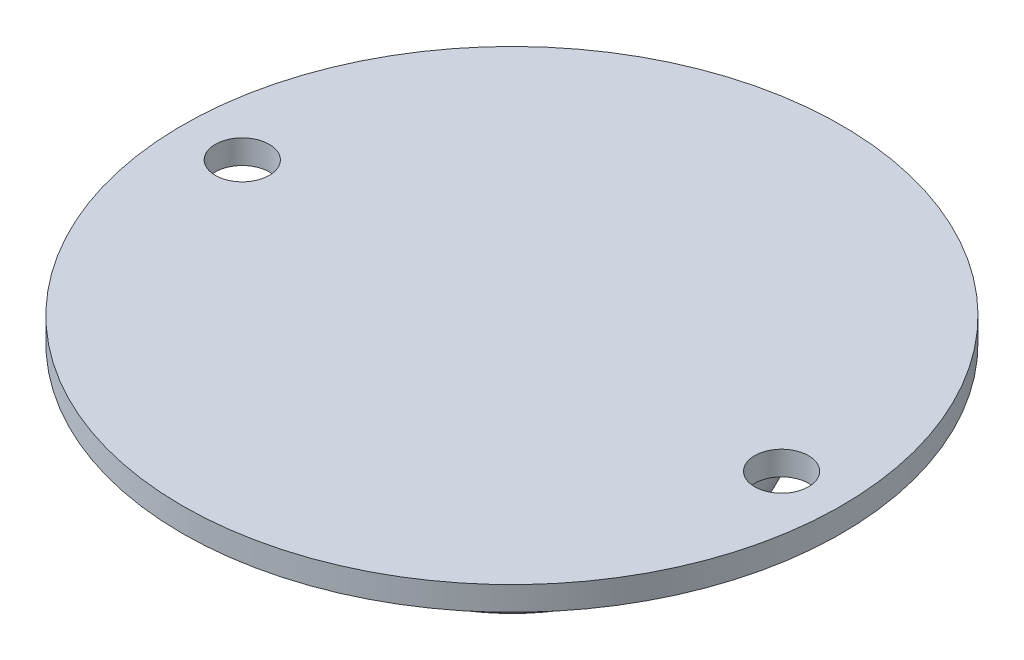
ISO-10303-21;
HEADER;
FILE_DESCRIPTION(('STEP AP214'),'2;1');
FILE_NAME('part.step','',(''),(''),'','','');
FILE_SCHEMA(('AUTOMOTIVE_DESIGN { 1 0 10303 214 1 1 1 1 }'));
ENDSEC;
DATA;
#1=APPLICATION_CONTEXT('core data for automotive mechanical design processes');
#2=APPLICATION_PROTOCOL_DEFINITION('international standard','automotive_design',2000,#1);
#3=PRODUCT_CONTEXT('',#1,'mechanical');
#4=PRODUCT('Part','Part','',(#3));
#5=PRODUCT_RELATED_PRODUCT_CATEGORY('part','',(#4));
#6=PRODUCT_DEFINITION_FORMATION('','',#4);
#7=PRODUCT_DEFINITION_CONTEXT('part definition',#1,'design');
#8=PRODUCT_DEFINITION('design','',#6,#7);
#9=PRODUCT_DEFINITION_SHAPE('','',#8);
#10=(LENGTH_UNIT() NAMED_UNIT(*) SI_UNIT(.MILLI.,.METRE.));
#11=(NAMED_UNIT(*) PLANE_ANGLE_UNIT() SI_UNIT($,.RADIAN.));
#12=(NAMED_UNIT(*) SI_UNIT($,.STERADIAN.) SOLID_ANGLE_UNIT());
#13=UNCERTAINTY_MEASURE_WITH_UNIT(LENGTH_MEASURE(1.E-05),#10,'distance_accuracy_value','');
#14=(GEOMETRIC_REPRESENTATION_CONTEXT(3) GLOBAL_UNCERTAINTY_ASSIGNED_CONTEXT((#13)) GLOBAL_UNIT_ASSIGNED_CONTEXT((#10,
#11,#12)) REPRESENTATION_CONTEXT('',''));
#15=CARTESIAN_POINT('',(0.,0.,0.));
#16=DIRECTION('',(0.,0.,1.));
#17=DIRECTION('',(1.,0.,0.));
#18=AXIS2_PLACEMENT_3D('',#15,#16,#17);
#19=CARTESIAN_POINT('',(0.,12.,0.));
#20=DIRECTION('',(0.,-1.,0.));
#21=DIRECTION('',(0.,0.,-1.));
#22=AXIS2_PLACEMENT_3D('',#19,#20,#21);
#23=CYLINDRICAL_SURFACE('',#22,17.5);
#24=DIRECTION('',(0.,-1.,0.));
#25=VECTOR('',#24,1.);
#26=CARTESIAN_POINT('',(-2.25,12.,-17.3547543918086));
#27=LINE('',#26,#25);
#28=CARTESIAN_POINT('',(-2.25,12.,-17.3547543918086));
#29=VERTEX_POINT('',#28);
#30=CARTESIAN_POINT('',(-2.25,10.,-17.3547543918086));
#31=VERTEX_POINT('',#30);
#32=EDGE_CURVE('E161',#29,#31,#27,.T.);
#33=ORIENTED_EDGE('',*,*,#32,.T.);
#34=CARTESIAN_POINT('',(0.,10.,0.));
#35=DIRECTION('',(0.,1.,0.));
#36=DIRECTION('',(0.,0.,1.));
#37=AXIS2_PLACEMENT_3D('',#34,#35,#36);
#38=CIRCLE('',#37,17.5);
#39=CARTESIAN_POINT('',(-2.25,10.,17.3547543918086));
#40=VERTEX_POINT('',#39);
#41=EDGE_CURVE('E102',#31,#40,#38,.T.);
#42=ORIENTED_EDGE('',*,*,#41,.T.);
#43=DIRECTION('',(0.,-1.,0.));
#44=VECTOR('',#43,1.);
#45=CARTESIAN_POINT('',(-2.25,12.,17.3547543918086));
#46=LINE('',#45,#44);
#47=CARTESIAN_POINT('',(-2.25,12.,17.3547543918086));
#48=VERTEX_POINT('',#47);
#49=EDGE_CURVE('E166',#40,#48,#46,.F.);
#50=ORIENTED_EDGE('',*,*,#49,.T.);
#51=CARTESIAN_POINT('',(0.,12.,0.));
#52=DIRECTION('',(0.,1.,0.));
#53=DIRECTION('',(0.,0.,1.));
#54=AXIS2_PLACEMENT_3D('',#51,#52,#53);
#55=CIRCLE('',#54,17.5);
#56=EDGE_CURVE('E103',#29,#48,#55,.T.);
#57=ORIENTED_EDGE('',*,*,#56,.F.);
#58=EDGE_LOOP('',(#33,#42,#50,#57));
#59=FACE_BOUND('',#58,.T.);
#60=ADVANCED_FACE('F33',(#59),#23,.T.);
#61=CARTESIAN_POINT('',(0.,0.,0.));
#62=DIRECTION('',(0.,1.,0.));
#63=DIRECTION('',(0.,0.,1.));
#64=AXIS2_PLACEMENT_3D('',#61,#62,#63);
#65=PLANE('',#64);
#66=DIRECTION('',(0.,0.,-1.));
#67=VECTOR('',#66,1.);
#68=CARTESIAN_POINT('',(-2.25,0.,-21.9035443512894));
#69=LINE('',#68,#67);
#70=CARTESIAN_POINT('',(-2.25,0.,7.1545440106271));
#71=VERTEX_POINT('',#70);
#72=CARTESIAN_POINT('',(-2.25,0.,-7.1545440106271));
#73=VERTEX_POINT('',#72);
#74=EDGE_CURVE('E286',#71,#73,#69,.T.);
#75=ORIENTED_EDGE('',*,*,#74,.F.);
#76=CARTESIAN_POINT('',(0.,0.,0.));
#77=DIRECTION('',(0.,1.,0.));
#78=DIRECTION('',(0.,0.,1.));
#79=AXIS2_PLACEMENT_3D('',#76,#77,#78);
#80=CIRCLE('',#79,7.50000000000001);
#81=EDGE_CURVE('E171',#71,#73,#80,.F.);
#82=ORIENTED_EDGE('',*,*,#81,.T.);
#83=EDGE_LOOP('',(#75,#82));
#84=FACE_BOUND('',#83,.T.);
#85=ADVANCED_FACE('F149',(#84),#65,.F.);
#86=DIRECTION('',(0.,-1.,0.));
#87=VECTOR('',#86,1.);
#88=CARTESIAN_POINT('',(2.25,12.,17.3547543918086));
#89=LINE('',#88,#87);
#90=CARTESIAN_POINT('',(2.25,12.,17.3547543918086));
#91=VERTEX_POINT('',#90);
#92=CARTESIAN_POINT('',(2.25,10.,17.3547543918086));
#93=VERTEX_POINT('',#92);
#94=EDGE_CURVE('E92',#91,#93,#89,.T.);
#95=ORIENTED_EDGE('',*,*,#94,.T.);
#96=CARTESIAN_POINT('',(0.,10.,0.));
#97=DIRECTION('',(0.,1.,0.));
#98=DIRECTION('',(0.,0.,1.));
#99=AXIS2_PLACEMENT_3D('',#96,#97,#98);
#100=CIRCLE('',#99,17.5);
#101=CARTESIAN_POINT('',(2.25,10.,-17.3547543918086));
#102=VERTEX_POINT('',#101);
#103=EDGE_CURVE('E91',#93,#102,#100,.T.);
#104=ORIENTED_EDGE('',*,*,#103,.T.);
#105=DIRECTION('',(0.,-1.,0.));
#106=VECTOR('',#105,1.);
#107=CARTESIAN_POINT('',(2.25,12.,-17.3547543918086));
#108=LINE('',#107,#106);
#109=CARTESIAN_POINT('',(2.25,12.,-17.3547543918086));
#110=VERTEX_POINT('',#109);
#111=EDGE_CURVE('E84',#102,#110,#108,.F.);
#112=ORIENTED_EDGE('',*,*,#111,.T.);
#113=EDGE_CURVE('E89',#91,#110,#55,.T.);
#114=ORIENTED_EDGE('',*,*,#113,.F.);
#115=EDGE_LOOP('',(#95,#104,#112,#114));
#116=FACE_BOUND('',#115,.T.);
#117=ADVANCED_FACE('F87',(#116),#23,.T.);
#118=DIRECTION('',(0.,0.,1.));
#119=VECTOR('',#118,1.);
#120=CARTESIAN_POINT('',(2.25,0.,-21.9035443512894));
#121=LINE('',#120,#119);
#122=CARTESIAN_POINT('',(2.25,0.,-7.1545440106271));
#123=VERTEX_POINT('',#122);
#124=CARTESIAN_POINT('',(2.25,0.,7.15454401062709));
#125=VERTEX_POINT('',#124);
#126=EDGE_CURVE('E184',#123,#125,#121,.T.);
#127=ORIENTED_EDGE('',*,*,#126,.F.);
#128=CARTESIAN_POINT('',(0.,0.,0.));
#129=DIRECTION('',(0.,1.,0.));
#130=DIRECTION('',(0.,0.,1.));
#131=AXIS2_PLACEMENT_3D('',#128,#129,#130);
#132=CIRCLE('',#131,7.50000000000001);
#133=EDGE_CURVE('E11',#123,#125,#132,.F.);
#134=ORIENTED_EDGE('',*,*,#133,.T.);
#135=EDGE_LOOP('',(#127,#134));
#136=FACE_BOUND('',#135,.T.);
#137=ADVANCED_FACE('F146',(#136),#65,.F.);
#138=CARTESIAN_POINT('',(0.,14.,0.));
#139=DIRECTION('',(0.,-1.,0.));
#140=DIRECTION('',(0.,0.,-1.));
#141=AXIS2_PLACEMENT_3D('',#138,#139,#140);
#142=CYLINDRICAL_SURFACE('',#141,27.5);
#143=CARTESIAN_POINT('',(0.,14.,0.));
#144=DIRECTION('',(0.,1.,0.));
#145=DIRECTION('',(0.,0.,1.));
#146=AXIS2_PLACEMENT_3D('',#143,#144,#145);
#147=CIRCLE('',#146,27.5);
#148=CARTESIAN_POINT('',(0.,14.,27.5));
#149=VERTEX_POINT('',#148);
#150=EDGE_CURVE('E109',#149,#149,#147,.T.);
#151=ORIENTED_EDGE('',*,*,#150,.F.);
#152=EDGE_LOOP('',(#151));
#153=FACE_BOUND('',#152,.T.);
#154=CARTESIAN_POINT('',(0.,12.,0.));
#155=DIRECTION('',(0.,1.,0.));
#156=DIRECTION('',(0.,0.,1.));
#157=AXIS2_PLACEMENT_3D('',#154,#155,#156);
#158=CIRCLE('',#157,27.5);
#159=CARTESIAN_POINT('',(0.,12.,27.5));
#160=VERTEX_POINT('',#159);
#161=EDGE_CURVE('E111',#160,#160,#158,.T.);
#162=ORIENTED_EDGE('',*,*,#161,.T.);
#163=EDGE_LOOP('',(#162));
#164=FACE_BOUND('',#163,.T.);
#165=ADVANCED_FACE('F139',(#153,#164),#142,.T.);
#166=CARTESIAN_POINT('',(0.,14.,0.));
#167=DIRECTION('',(0.,1.,0.));
#168=DIRECTION('',(0.,0.,1.));
#169=AXIS2_PLACEMENT_3D('',#166,#167,#168);
#170=PLANE('',#169);
#171=CARTESIAN_POINT('',(-22.5,14.,0.));
#172=DIRECTION('',(0.,1.,0.));
#173=DIRECTION('',(0.,0.,1.));
#174=AXIS2_PLACEMENT_3D('',#171,#172,#173);
#175=CIRCLE('',#174,2.25);
#176=CARTESIAN_POINT('',(-22.5,14.,2.25));
#177=VERTEX_POINT('',#176);
#178=EDGE_CURVE('E273',#177,#177,#175,.T.);
#179=ORIENTED_EDGE('',*,*,#178,.F.);
#180=EDGE_LOOP('',(#179));
#181=FACE_BOUND('',#180,.T.);
#182=CARTESIAN_POINT('',(22.5,14.,0.));
#183=DIRECTION('',(0.,1.,0.));
#184=DIRECTION('',(0.,0.,1.));
#185=AXIS2_PLACEMENT_3D('',#182,#183,#184);
#186=CIRCLE('',#185,2.25);
#187=CARTESIAN_POINT('',(22.5,14.,2.25));
#188=VERTEX_POINT('',#187);
#189=EDGE_CURVE('E283',#188,#188,#186,.T.);
#190=ORIENTED_EDGE('',*,*,#189,.F.);
#191=EDGE_LOOP('',(#190));
#192=FACE_BOUND('',#191,.T.);
#193=ORIENTED_EDGE('',*,*,#150,.T.);
#194=EDGE_LOOP('',(#193));
#195=FACE_BOUND('',#194,.T.);
#196=ADVANCED_FACE('F135',(#181,#192,#195),#170,.T.);
#197=CARTESIAN_POINT('',(0.,12.,0.));
#198=DIRECTION('',(0.,1.,0.));
#199=DIRECTION('',(0.,0.,1.));
#200=AXIS2_PLACEMENT_3D('',#197,#198,#199);
#201=PLANE('',#200);
#202=CARTESIAN_POINT('',(-22.5,12.,0.));
#203=DIRECTION('',(0.,-1.,0.));
#204=DIRECTION('',(0.,0.,-1.));
#205=AXIS2_PLACEMENT_3D('',#202,#203,#204);
#206=CIRCLE('',#205,2.25);
#207=CARTESIAN_POINT('',(-22.5,12.,-2.25));
#208=VERTEX_POINT('',#207);
#209=EDGE_CURVE('E276',#208,#208,#206,.T.);
#210=ORIENTED_EDGE('',*,*,#209,.F.);
#211=EDGE_LOOP('',(#210));
#212=FACE_BOUND('',#211,.T.);
#213=CARTESIAN_POINT('',(22.5,12.,0.));
#214=DIRECTION('',(0.,-1.,0.));
#215=DIRECTION('',(0.,0.,-1.));
#216=AXIS2_PLACEMENT_3D('',#213,#214,#215);
#217=CIRCLE('',#216,2.25);
#218=CARTESIAN_POINT('',(22.5,12.,-2.25));
#219=VERTEX_POINT('',#218);
#220=EDGE_CURVE('E278',#219,#219,#217,.T.);
#221=ORIENTED_EDGE('',*,*,#220,.F.);
#222=EDGE_LOOP('',(#221));
#223=FACE_BOUND('',#222,.T.);
#224=DIRECTION('',(0.,0.,-1.));
#225=VECTOR('',#224,1.);
#226=CARTESIAN_POINT('',(-2.25,12.,-21.9035443512894));
#227=LINE('',#226,#225);
#228=EDGE_CURVE('E98',#48,#29,#227,.T.);
#229=ORIENTED_EDGE('',*,*,#228,.T.);
#230=ORIENTED_EDGE('',*,*,#56,.T.);
#231=EDGE_LOOP('',(#229,#230));
#232=FACE_BOUND('',#231,.T.);
#233=ORIENTED_EDGE('',*,*,#113,.T.);
#234=DIRECTION('',(0.,0.,1.));
#235=VECTOR('',#234,1.);
#236=CARTESIAN_POINT('',(2.25,12.,-21.9035443512894));
#237=LINE('',#236,#235);
#238=EDGE_CURVE('E93',#110,#91,#237,.T.);
#239=ORIENTED_EDGE('',*,*,#238,.T.);
#240=EDGE_LOOP('',(#233,#239));
#241=FACE_BOUND('',#240,.T.);
#242=ORIENTED_EDGE('',*,*,#161,.F.);
#243=EDGE_LOOP('',(#242));
#244=FACE_BOUND('',#243,.T.);
#245=ADVANCED_FACE('F100',(#212,#223,#232,#241,#244),#201,.F.);
#246=CARTESIAN_POINT('',(-2.25,56.0376091607572,-21.9035443512894));
#247=DIRECTION('',(-1.,0.,0.));
#248=DIRECTION('',(0.,0.,1.));
#249=AXIS2_PLACEMENT_3D('',#246,#247,#248);
#250=PLANE('',#249);
#251=ORIENTED_EDGE('',*,*,#49,.F.);
#252=CARTESIAN_POINT('',(-2.25,10.,17.3547543918086));
#253=CARTESIAN_POINT('',(-2.25,9.72075758345696,17.3547851548186));
#254=CARTESIAN_POINT('',(-2.25,9.44151985552662,17.3429613553299));
#255=CARTESIAN_POINT('',(-2.25,8.88504861329375,17.2958269927778));
#256=CARTESIAN_POINT('',(-2.25,8.60781498846542,17.2605177350765));
#257=CARTESIAN_POINT('',(-2.25,8.05756983275056,17.1666781784053));
#258=CARTESIAN_POINT('',(-2.25,7.78455463475679,17.1081693820687));
#259=CARTESIAN_POINT('',(-2.25,7.24442574681187,16.9683658481769));
#260=CARTESIAN_POINT('',(-2.25,6.97731199240333,16.8870713596269));
#261=CARTESIAN_POINT('',(-2.25,6.45075991447519,16.7022427484806));
#262=CARTESIAN_POINT('',(-2.25,6.1913250514883,16.5986987675587));
#263=CARTESIAN_POINT('',(-2.25,5.68208952318507,16.3701447485989));
#264=CARTESIAN_POINT('',(-2.25,5.43228888501358,16.2451346500847));
#265=CARTESIAN_POINT('',(-2.25,4.94410843450086,15.9745692094334));
#266=CARTESIAN_POINT('',(-2.25,4.70572743673211,15.8290160060115));
#267=CARTESIAN_POINT('',(-2.25,4.24203009947778,15.5184093333134));
#268=CARTESIAN_POINT('',(-2.25,4.01671371435312,15.3533559321642));
#269=CARTESIAN_POINT('',(-2.25,3.58027350716704,15.0045907148946));
#270=CARTESIAN_POINT('',(-2.25,3.36917913617393,14.8208420458456));
#271=CARTESIAN_POINT('',(-2.25,2.96314009130131,14.4362929546114));
#272=CARTESIAN_POINT('',(-2.25,2.76819549077723,14.2354924549819));
#273=CARTESIAN_POINT('',(-2.25,2.39578056982396,13.8182827651239));
#274=CARTESIAN_POINT('',(-2.25,2.21831084019082,13.6018730476023));
#275=CARTESIAN_POINT('',(-2.25,1.88204229658536,13.1550096401927));
#276=CARTESIAN_POINT('',(-2.25,1.7232433309928,12.9245560643742));
#277=CARTESIAN_POINT('',(-2.25,1.42431174028986,12.4496074245073));
#278=CARTESIAN_POINT('',(-2.25,1.28431638457265,12.2050259721813));
#279=CARTESIAN_POINT('',(-2.25,1.02518279104911,11.7050515788222));
#280=CARTESIAN_POINT('',(-2.25,0.906044838062406,11.4496584902091));
#281=CARTESIAN_POINT('',(-2.25,0.689323013578664,10.9298869510573));
#282=CARTESIAN_POINT('',(-2.25,0.591739728413439,10.6655082563169));
#283=CARTESIAN_POINT('',(-2.25,0.41864090509689,10.1296625070838));
#284=CARTESIAN_POINT('',(-2.25,0.343121297935365,9.85819676966439));
#285=CARTESIAN_POINT('',(-2.25,0.232028197124304,9.38509308196716));
#286=CARTESIAN_POINT('',(-2.25,0.191178674229247,9.1846747227587));
#287=CARTESIAN_POINT('',(-2.25,0.121279805279356,8.78181156809586));
#288=CARTESIAN_POINT('',(-2.25,0.0922287727241407,8.57936706650437));
#289=CARTESIAN_POINT('',(-2.25,0.0459278945077788,8.17352289782172));
#290=CARTESIAN_POINT('',(-2.25,0.0286561506502915,7.97012571480343));
#291=CARTESIAN_POINT('',(-2.25,0.00568387564638755,7.56266361710929));
#292=CARTESIAN_POINT('',(-2.25,-1.58827070756387E-05,7.35859865874992));
#293=CARTESIAN_POINT('',(-2.25,0.,7.1545440106271));
#294=B_SPLINE_CURVE_WITH_KNOTS('',3,(#252,#253,#254,#255,#256,#257,#258,#259,#260,#261,#262,
#263,#264,#265,#266,#267,#268,#269,#270,#271,#272,#273,#274,#275,#276,#277,#278,#279,#280,#281,
#282,#283,#284,#285,#286,#287,#288,#289,#290,#291,#292,#293),.UNSPECIFIED.,.F.,.F.,(4,2,2,2,2,2,
2,2,2,2,2,2,2,2,2,2,2,2,2,2,4),(0.,0.837470359292877,1.67489417443419,2.51154362576911,
3.34818393443663,4.1851957096736,5.02220984305483,5.85913690020554,6.69606103351301,
7.53466814460754,8.37327906461191,9.21191832691684,10.0505507783885,10.8950064194101,
11.7394735910512,12.5839637311284,13.4282980308592,14.0415862842301,14.6547868420409,
15.2668443037239,15.8789426380936),.UNSPECIFIED.);
#295=EDGE_CURVE('E119',#40,#71,#294,.T.);
#296=ORIENTED_EDGE('',*,*,#295,.T.);
#297=ORIENTED_EDGE('',*,*,#74,.T.);
#298=CARTESIAN_POINT('',(-2.25,0.,-7.1545440106271));
#299=CARTESIAN_POINT('',(-2.25,-2.19400607685521E-06,-7.30483882748588));
#300=CARTESIAN_POINT('',(-2.25,0.00308418264488576,-7.4551185059908));
#301=CARTESIAN_POINT('',(-2.25,0.015510773314715,-7.75542255484197));
#302=CARTESIAN_POINT('',(-2.25,0.0248511566737418,-7.90544691816475));
#303=CARTESIAN_POINT('',(-2.25,0.062368833743885,-8.35479580684091));
#304=CARTESIAN_POINT('',(-2.25,0.100042663335506,-8.6533875206342));
#305=CARTESIAN_POINT('',(-2.25,0.200935539389278,-9.24629187298847));
#306=CARTESIAN_POINT('',(-2.25,0.264162528644993,-9.54060315154894));
#307=CARTESIAN_POINT('',(-2.25,0.416022561258401,-10.1225791147791));
#308=CARTESIAN_POINT('',(-2.25,0.504652505055381,-10.4102446057149));
#309=CARTESIAN_POINT('',(-2.25,0.705453814039598,-10.9726466783635));
#310=CARTESIAN_POINT('',(-2.25,0.817273965596259,-11.2475086725631));
#311=CARTESIAN_POINT('',(-2.25,1.06451161880262,-11.786412940527));
#312=CARTESIAN_POINT('',(-2.25,1.19992901459761,-12.0504552628207));
#313=CARTESIAN_POINT('',(-2.25,1.49333720893374,-12.5654250616263));
#314=CARTESIAN_POINT('',(-2.25,1.65131100212215,-12.816362225262));
#315=CARTESIAN_POINT('',(-2.25,1.98877369401678,-13.303318404731));
#316=CARTESIAN_POINT('',(-2.25,2.16826162414225,-13.5393380914288));
#317=CARTESIAN_POINT('',(-2.25,2.53993047133185,-13.9855743890789));
#318=CARTESIAN_POINT('',(-2.25,2.73133072158371,-14.1964417712314));
#319=CARTESIAN_POINT('',(-2.25,3.13140710124626,-14.6010935378601));
#320=CARTESIAN_POINT('',(-2.25,3.34008282787272,-14.794878320406));
#321=CARTESIAN_POINT('',(-2.25,3.77329224770527,-15.1639736628282));
#322=CARTESIAN_POINT('',(-2.25,3.99783090467646,-15.339278396853));
#323=CARTESIAN_POINT('',(-2.25,4.46108471617648,-15.670024644236));
#324=CARTESIAN_POINT('',(-2.25,4.69979955410068,-15.8254666009565));
#325=CARTESIAN_POINT('',(-2.25,5.18646810459057,-16.1134249117251));
#326=CARTESIAN_POINT('',(-2.25,5.43426025088237,-16.2462143935981));
#327=CARTESIAN_POINT('',(-2.25,5.94019116022578,-16.4903329090843));
#328=CARTESIAN_POINT('',(-2.25,6.1983296438082,-16.6016625218876));
#329=CARTESIAN_POINT('',(-2.25,6.7229318731232,-16.8019755815104));
#330=CARTESIAN_POINT('',(-2.25,6.989389558752,-16.8909748865875));
#331=CARTESIAN_POINT('',(-2.25,7.52878309338505,-17.0460515391402));
#332=CARTESIAN_POINT('',(-2.25,7.80171697821553,-17.1121357439743));
#333=CARTESIAN_POINT('',(-2.25,8.39367835054633,-17.2291191713168));
#334=CARTESIAN_POINT('',(-2.25,8.71346702162066,-17.2762421862912));
#335=CARTESIAN_POINT('',(-2.25,9.19507260383466,-17.323349930042));
#336=CARTESIAN_POINT('',(-2.25,9.35582403072993,-17.3351230385059));
#337=CARTESIAN_POINT('',(-2.25,9.67770739587766,-17.3508248787828));
#338=CARTESIAN_POINT('',(-2.25,9.83883932896986,-17.3547537163721));
#339=CARTESIAN_POINT('',(-2.25,10.,-17.3547543918086));
#340=B_SPLINE_CURVE_WITH_KNOTS('',3,(#298,#299,#300,#301,#302,#303,#304,#305,#306,#307,#308,
#309,#310,#311,#312,#313,#314,#315,#316,#317,#318,#319,#320,#321,#322,#323,#324,#325,#326,#327,
#328,#329,#330,#331,#332,#333,#334,#335,#336,#337,#338,#339),.UNSPECIFIED.,.F.,.F.,(4,2,2,2,2,2,
2,2,2,2,2,2,2,2,2,2,2,2,2,2,4),(0.,0.450820368462377,0.901652944311859,1.80334384463819,
2.70531523707758,3.60717662161233,4.49626431509577,5.38534802032989,6.27376494680885,
7.16214189117922,8.015452818307,8.86874385576974,9.72230309454832,10.5758432774713,
11.4182257192695,12.2605854224426,13.1023452050973,13.9438528727677,14.9118645081344,
15.3952477991452,15.8786245719207),.UNSPECIFIED.);
#341=EDGE_CURVE('E106',#73,#31,#340,.T.);
#342=ORIENTED_EDGE('',*,*,#341,.T.);
#343=ORIENTED_EDGE('',*,*,#32,.F.);
#344=ORIENTED_EDGE('',*,*,#228,.F.);
#345=EDGE_LOOP('',(#251,#296,#297,#342,#343,#344));
#346=FACE_BOUND('',#345,.T.);
#347=ADVANCED_FACE('F127',(#346),#250,.F.);
#348=CARTESIAN_POINT('',(2.25,56.0376091607572,-21.9035443512894));
#349=DIRECTION('',(1.,0.,0.));
#350=DIRECTION('',(0.,0.,-1.));
#351=AXIS2_PLACEMENT_3D('',#348,#349,#350);
#352=PLANE('',#351);
#353=ORIENTED_EDGE('',*,*,#111,.F.);
#354=CARTESIAN_POINT('',(2.25,10.,-17.3547543918086));
#355=CARTESIAN_POINT('',(2.25,9.72075758345696,-17.3547851548186));
#356=CARTESIAN_POINT('',(2.25,9.44151985552662,-17.3429613553299));
#357=CARTESIAN_POINT('',(2.25,8.88504861329376,-17.2958269927778));
#358=CARTESIAN_POINT('',(2.25,8.60781498846542,-17.2605177350765));
#359=CARTESIAN_POINT('',(2.25,8.05756983275056,-17.1666781784053));
#360=CARTESIAN_POINT('',(2.25,7.78455463475678,-17.1081693820687));
#361=CARTESIAN_POINT('',(2.25,7.24442574681187,-16.9683658481769));
#362=CARTESIAN_POINT('',(2.25,6.97731199240333,-16.8870713596269));
#363=CARTESIAN_POINT('',(2.25,6.45075991447519,-16.7022427484806));
#364=CARTESIAN_POINT('',(2.25,6.1913250514883,-16.5986987675587));
#365=CARTESIAN_POINT('',(2.25,5.68208952318507,-16.3701447485989));
#366=CARTESIAN_POINT('',(2.25,5.43228888501358,-16.2451346500847));
#367=CARTESIAN_POINT('',(2.25,4.94410843450086,-15.9745692094334));
#368=CARTESIAN_POINT('',(2.25,4.70572743673211,-15.8290160060115));
#369=CARTESIAN_POINT('',(2.25,4.24203009947778,-15.5184093333134));
#370=CARTESIAN_POINT('',(2.25,4.01671371435312,-15.3533559321642));
#371=CARTESIAN_POINT('',(2.25,3.58027350716704,-15.0045907148946));
#372=CARTESIAN_POINT('',(2.25,3.36917913617393,-14.8208420458456));
#373=CARTESIAN_POINT('',(2.25,2.96314009130131,-14.4362929546114));
#374=CARTESIAN_POINT('',(2.25,2.76819549077724,-14.2354924549819));
#375=CARTESIAN_POINT('',(2.25,2.39578056982396,-13.8182827651239));
#376=CARTESIAN_POINT('',(2.25,2.21831084019082,-13.6018730476023));
#377=CARTESIAN_POINT('',(2.25,1.88204229658536,-13.1550096401927));
#378=CARTESIAN_POINT('',(2.25,1.72324333099281,-12.9245560643742));
#379=CARTESIAN_POINT('',(2.25,1.42431174028986,-12.4496074245073));
#380=CARTESIAN_POINT('',(2.25,1.28431638457265,-12.2050259721813));
#381=CARTESIAN_POINT('',(2.25,1.02518279104911,-11.7050515788222));
#382=CARTESIAN_POINT('',(2.25,0.906044838062408,-11.4496584902091));
#383=CARTESIAN_POINT('',(2.25,0.689323013578667,-10.9298869510573));
#384=CARTESIAN_POINT('',(2.25,0.59173972841344,-10.665508256317));
#385=CARTESIAN_POINT('',(2.25,0.418640905096889,-10.1296625070838));
#386=CARTESIAN_POINT('',(2.25,0.343121297935364,-9.85819676966439));
#387=CARTESIAN_POINT('',(2.25,0.232028197124305,-9.38509308196717));
#388=CARTESIAN_POINT('',(2.25,0.191178674229249,-9.18467472275871));
#389=CARTESIAN_POINT('',(2.25,0.121279805279358,-8.78181156809586));
#390=CARTESIAN_POINT('',(2.25,0.0922287727241423,-8.57936706650437));
#391=CARTESIAN_POINT('',(2.25,0.0459278945077792,-8.17352289782172));
#392=CARTESIAN_POINT('',(2.25,0.0286561506502913,-7.97012571480343));
#393=CARTESIAN_POINT('',(2.25,0.00568387564638667,-7.56266361710929));
#394=CARTESIAN_POINT('',(2.25,-1.58827070764858E-05,-7.35859865874992));
#395=CARTESIAN_POINT('',(2.25,0.,-7.1545440106271));
#396=B_SPLINE_CURVE_WITH_KNOTS('',3,(#354,#355,#356,#357,#358,#359,#360,#361,#362,#363,#364,
#365,#366,#367,#368,#369,#370,#371,#372,#373,#374,#375,#376,#377,#378,#379,#380,#381,#382,#383,
#384,#385,#386,#387,#388,#389,#390,#391,#392,#393,#394,#395),.UNSPECIFIED.,.F.,.F.,(4,2,2,2,2,2,
2,2,2,2,2,2,2,2,2,2,2,2,2,2,4),(0.,0.837470359292875,1.67489417443419,2.51154362576911,
3.34818393443663,4.1851957096736,5.02220984305483,5.85913690020554,6.69606103351301,
7.53466814460754,8.37327906461191,9.21191832691683,10.0505507783885,10.8950064194101,
11.7394735910512,12.5839637311284,13.4282980308592,14.0415862842301,14.6547868420409,
15.2668443037239,15.8789426380936),.UNSPECIFIED.);
#397=EDGE_CURVE('E42',#102,#123,#396,.T.);
#398=ORIENTED_EDGE('',*,*,#397,.T.);
#399=ORIENTED_EDGE('',*,*,#126,.T.);
#400=CARTESIAN_POINT('',(2.25,0.,7.1545440106271));
#401=CARTESIAN_POINT('',(2.25,-2.19400607512009E-06,7.30483882748588));
#402=CARTESIAN_POINT('',(2.25,0.00308418264488764,7.4551185059908));
#403=CARTESIAN_POINT('',(2.25,0.015510773314716,7.75542255484196));
#404=CARTESIAN_POINT('',(2.25,0.0248511566737419,7.90544691816475));
#405=CARTESIAN_POINT('',(2.25,0.0623688337438833,8.35479580684091));
#406=CARTESIAN_POINT('',(2.25,0.100042663335505,8.6533875206342));
#407=CARTESIAN_POINT('',(2.25,0.200935539389277,9.24629187298847));
#408=CARTESIAN_POINT('',(2.25,0.264162528644992,9.54060315154894));
#409=CARTESIAN_POINT('',(2.25,0.416022561258401,10.1225791147791));
#410=CARTESIAN_POINT('',(2.25,0.50465250505538,10.4102446057149));
#411=CARTESIAN_POINT('',(2.25,0.705453814039598,10.9726466783635));
#412=CARTESIAN_POINT('',(2.25,0.81727396559626,11.2475086725631));
#413=CARTESIAN_POINT('',(2.25,1.06451161880262,11.786412940527));
#414=CARTESIAN_POINT('',(2.25,1.19992901459761,12.0504552628207));
#415=CARTESIAN_POINT('',(2.25,1.49333720893373,12.5654250616263));
#416=CARTESIAN_POINT('',(2.25,1.65131100212215,12.816362225262));
#417=CARTESIAN_POINT('',(2.25,1.98877369401678,13.303318404731));
#418=CARTESIAN_POINT('',(2.25,2.16826162414225,13.5393380914288));
#419=CARTESIAN_POINT('',(2.25,2.53993047133185,13.9855743890789));
#420=CARTESIAN_POINT('',(2.25,2.73133072158371,14.1964417712314));
#421=CARTESIAN_POINT('',(2.25,3.13140710124626,14.6010935378601));
#422=CARTESIAN_POINT('',(2.25,3.34008282787272,14.794878320406));
#423=CARTESIAN_POINT('',(2.25,3.77329224770528,15.1639736628282));
#424=CARTESIAN_POINT('',(2.25,3.99783090467646,15.3392783968531));
#425=CARTESIAN_POINT('',(2.25,4.46108471617648,15.670024644236));
#426=CARTESIAN_POINT('',(2.25,4.69979955410068,15.8254666009565));
#427=CARTESIAN_POINT('',(2.25,5.18646810459057,16.1134249117251));
#428=CARTESIAN_POINT('',(2.25,5.43426025088238,16.2462143935981));
#429=CARTESIAN_POINT('',(2.25,5.94019116022578,16.4903329090843));
#430=CARTESIAN_POINT('',(2.25,6.1983296438082,16.6016625218876));
#431=CARTESIAN_POINT('',(2.25,6.7229318731232,16.8019755815104));
#432=CARTESIAN_POINT('',(2.25,6.989389558752,16.8909748865875));
#433=CARTESIAN_POINT('',(2.25,7.52878309338506,17.0460515391402));
#434=CARTESIAN_POINT('',(2.25,7.80171697821554,17.1121357439743));
#435=CARTESIAN_POINT('',(2.25,8.39367835054633,17.2291191713168));
#436=CARTESIAN_POINT('',(2.25,8.71346702162066,17.2762421862912));
#437=CARTESIAN_POINT('',(2.25,9.19507260383466,17.323349930042));
#438=CARTESIAN_POINT('',(2.25,9.35582403072993,17.3351230385059));
#439=CARTESIAN_POINT('',(2.25,9.67770739587766,17.3508248787828));
#440=CARTESIAN_POINT('',(2.25,9.83883932896986,17.3547537163722));
#441=CARTESIAN_POINT('',(2.25,10.,17.3547543918086));
#442=B_SPLINE_CURVE_WITH_KNOTS('',3,(#400,#401,#402,#403,#404,#405,#406,#407,#408,#409,#410,
#411,#412,#413,#414,#415,#416,#417,#418,#419,#420,#421,#422,#423,#424,#425,#426,#427,#428,#429,
#430,#431,#432,#433,#434,#435,#436,#437,#438,#439,#440,#441),.UNSPECIFIED.,.F.,.F.,(4,2,2,2,2,2,
2,2,2,2,2,2,2,2,2,2,2,2,2,2,4),(0.,0.450820368462375,0.901652944311857,1.80334384463819,
2.70531523707758,3.60717662161233,4.49626431509577,5.38534802032989,6.27376494680885,
7.16214189117922,8.01545281830701,8.86874385576975,9.72230309454833,10.5758432774713,
11.4182257192695,12.2605854224426,13.1023452050973,13.9438528727677,14.9118645081344,
15.3952477991452,15.8786245719207),.UNSPECIFIED.);
#443=EDGE_CURVE('E174',#125,#93,#442,.T.);
#444=ORIENTED_EDGE('',*,*,#443,.T.);
#445=ORIENTED_EDGE('',*,*,#94,.F.);
#446=ORIENTED_EDGE('',*,*,#238,.F.);
#447=EDGE_LOOP('',(#353,#398,#399,#444,#445,#446));
#448=FACE_BOUND('',#447,.T.);
#449=ADVANCED_FACE('F96',(#448),#352,.F.);
#450=CARTESIAN_POINT('',(0.,10.,0.));
#451=DIRECTION('',(0.,1.,0.));
#452=DIRECTION('',(0.,0.,1.));
#453=AXIS2_PLACEMENT_3D('',#450,#451,#452);
#454=DEGENERATE_TOROIDAL_SURFACE('',#453,7.50000000000001,10.,.T.);
#455=ORIENTED_EDGE('',*,*,#341,.F.);
#456=ORIENTED_EDGE('',*,*,#81,.F.);
#457=ORIENTED_EDGE('',*,*,#295,.F.);
#458=ORIENTED_EDGE('',*,*,#41,.F.);
#459=EDGE_LOOP('',(#455,#456,#457,#458));
#460=FACE_BOUND('',#459,.T.);
#461=ADVANCED_FACE('F124',(#460),#454,.T.);
#462=CARTESIAN_POINT('',(0.,10.,0.));
#463=DIRECTION('',(0.,1.,0.));
#464=DIRECTION('',(0.,0.,1.));
#465=AXIS2_PLACEMENT_3D('',#462,#463,#464);
#466=DEGENERATE_TOROIDAL_SURFACE('',#465,7.50000000000001,10.,.T.);
#467=ORIENTED_EDGE('',*,*,#443,.F.);
#468=ORIENTED_EDGE('',*,*,#133,.F.);
#469=ORIENTED_EDGE('',*,*,#397,.F.);
#470=ORIENTED_EDGE('',*,*,#103,.F.);
#471=EDGE_LOOP('',(#467,#468,#469,#470));
#472=FACE_BOUND('',#471,.T.);
#473=ADVANCED_FACE('F35',(#472),#466,.T.);
#474=CARTESIAN_POINT('',(22.5,113.6,0.));
#475=DIRECTION('',(0.,-1.,0.));
#476=DIRECTION('',(0.,0.,-1.));
#477=AXIS2_PLACEMENT_3D('',#474,#475,#476);
#478=CYLINDRICAL_SURFACE('',#477,2.25);
#479=ORIENTED_EDGE('',*,*,#189,.T.);
#480=EDGE_LOOP('',(#479));
#481=FACE_BOUND('',#480,.T.);
#482=ORIENTED_EDGE('',*,*,#220,.T.);
#483=EDGE_LOOP('',(#482));
#484=FACE_BOUND('',#483,.T.);
#485=ADVANCED_FACE('F188',(#481,#484),#478,.F.);
#486=CARTESIAN_POINT('',(-22.5,113.6,0.));
#487=DIRECTION('',(0.,-1.,0.));
#488=DIRECTION('',(0.,0.,-1.));
#489=AXIS2_PLACEMENT_3D('',#486,#487,#488);
#490=CYLINDRICAL_SURFACE('',#489,2.25);
#491=ORIENTED_EDGE('',*,*,#178,.T.);
#492=EDGE_LOOP('',(#491));
#493=FACE_BOUND('',#492,.T.);
#494=ORIENTED_EDGE('',*,*,#209,.T.);
#495=EDGE_LOOP('',(#494));
#496=FACE_BOUND('',#495,.T.);
#497=ADVANCED_FACE('F193',(#493,#496),#490,.F.);
#498=CLOSED_SHELL('',(#60,#85,#117,#137,#165,#196,#245,#347,#449,#461,#473,#485,#497));
#499=MANIFOLD_SOLID_BREP('B2',#498);
#500=ADVANCED_BREP_SHAPE_REPRESENTATION('',(#18,#499),#14);
#501=SHAPE_DEFINITION_REPRESENTATION(#9,#500);
ENDSEC;
END-ISO-10303-21;
